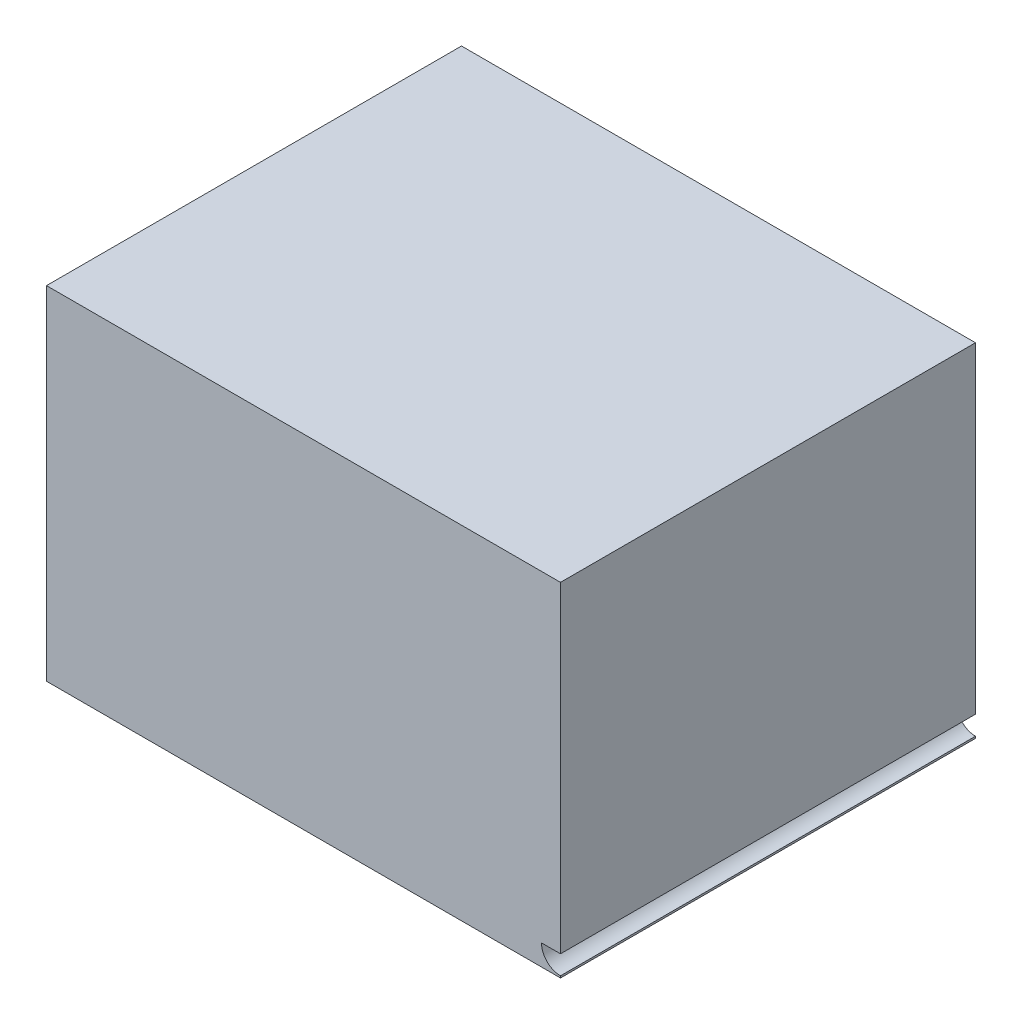
ISO-10303-21;
HEADER;
FILE_DESCRIPTION(('STEP AP214'),'2;1');
FILE_NAME('part.step','',(''),(''),'','','');
FILE_SCHEMA(('AUTOMOTIVE_DESIGN { 1 0 10303 214 1 1 1 1 }'));
ENDSEC;
DATA;
#1=APPLICATION_CONTEXT('core data for automotive mechanical design processes');
#2=APPLICATION_PROTOCOL_DEFINITION('international standard','automotive_design',2000,#1);
#3=PRODUCT_CONTEXT('',#1,'mechanical');
#4=PRODUCT('Part','Part','',(#3));
#5=PRODUCT_RELATED_PRODUCT_CATEGORY('part','',(#4));
#6=PRODUCT_DEFINITION_FORMATION('','',#4);
#7=PRODUCT_DEFINITION_CONTEXT('part definition',#1,'design');
#8=PRODUCT_DEFINITION('design','',#6,#7);
#9=PRODUCT_DEFINITION_SHAPE('','',#8);
#10=(LENGTH_UNIT() NAMED_UNIT(*) SI_UNIT(.MILLI.,.METRE.));
#11=(NAMED_UNIT(*) PLANE_ANGLE_UNIT() SI_UNIT($,.RADIAN.));
#12=(NAMED_UNIT(*) SI_UNIT($,.STERADIAN.) SOLID_ANGLE_UNIT());
#13=UNCERTAINTY_MEASURE_WITH_UNIT(LENGTH_MEASURE(1.E-05),#10,'distance_accuracy_value','');
#14=(GEOMETRIC_REPRESENTATION_CONTEXT(3) GLOBAL_UNCERTAINTY_ASSIGNED_CONTEXT((#13)) GLOBAL_UNIT_ASSIGNED_CONTEXT((#10,
#11,#12)) REPRESENTATION_CONTEXT('',''));
#15=CARTESIAN_POINT('',(0.,0.,0.));
#16=DIRECTION('',(0.,0.,1.));
#17=DIRECTION('',(1.,0.,0.));
#18=AXIS2_PLACEMENT_3D('',#15,#16,#17);
#19=CARTESIAN_POINT('',(-17.75,121.623637996561,-10.));
#20=DIRECTION('',(0.,0.,1.));
#21=DIRECTION('',(1.,0.,0.));
#22=AXIS2_PLACEMENT_3D('',#19,#20,#21);
#23=PLANE('',#22);
#24=DIRECTION('',(0.,-1.,0.));
#25=VECTOR('',#24,1.);
#26=CARTESIAN_POINT('',(-17.75,121.623637996561,-10.));
#27=LINE('',#26,#25);
#28=CARTESIAN_POINT('',(-17.75,70.,-10.));
#29=VERTEX_POINT('',#28);
#30=CARTESIAN_POINT('',(-17.75,53.1,-10.));
#31=VERTEX_POINT('',#30);
#32=EDGE_CURVE('E127',#29,#31,#27,.T.);
#33=ORIENTED_EDGE('',*,*,#32,.T.);
#34=DIRECTION('',(1.,0.,0.));
#35=VECTOR('',#34,1.);
#36=CARTESIAN_POINT('',(-18.75,53.1,-10.));
#37=LINE('',#36,#35);
#38=CARTESIAN_POINT('',(-18.75,53.1,-10.));
#39=VERTEX_POINT('',#38);
#40=EDGE_CURVE('E138',#39,#31,#37,.T.);
#41=ORIENTED_EDGE('',*,*,#40,.F.);
#42=CARTESIAN_POINT('',(-17.75,53.1,-10.));
#43=DIRECTION('',(0.,0.,-1.));
#44=DIRECTION('',(-1.,0.,0.));
#45=AXIS2_PLACEMENT_3D('',#42,#43,#44);
#46=CIRCLE('',#45,1.);
#47=CARTESIAN_POINT('',(-17.75,52.1,-10.));
#48=VERTEX_POINT('',#47);
#49=EDGE_CURVE('E144',#48,#39,#46,.T.);
#50=ORIENTED_EDGE('',*,*,#49,.F.);
#51=CARTESIAN_POINT('',(-17.75,52.,-10.));
#52=VERTEX_POINT('',#51);
#53=EDGE_CURVE('E130',#48,#52,#27,.T.);
#54=ORIENTED_EDGE('',*,*,#53,.T.);
#55=DIRECTION('',(-1.,0.,0.));
#56=VECTOR('',#55,1.);
#57=CARTESIAN_POINT('',(-17.75,52.,-10.));
#58=LINE('',#57,#56);
#59=CARTESIAN_POINT('',(-44.75,52.,-10.));
#60=VERTEX_POINT('',#59);
#61=EDGE_CURVE('E129',#52,#60,#58,.T.);
#62=ORIENTED_EDGE('',*,*,#61,.T.);
#63=DIRECTION('',(0.,-1.,0.));
#64=VECTOR('',#63,1.);
#65=CARTESIAN_POINT('',(-44.75,121.623637996561,-10.));
#66=LINE('',#65,#64);
#67=CARTESIAN_POINT('',(-44.75,70.,-10.));
#68=VERTEX_POINT('',#67);
#69=EDGE_CURVE('E61',#68,#60,#66,.T.);
#70=ORIENTED_EDGE('',*,*,#69,.F.);
#71=DIRECTION('',(-1.,0.,0.));
#72=VECTOR('',#71,1.);
#73=CARTESIAN_POINT('',(-17.75,70.,-10.));
#74=LINE('',#73,#72);
#75=EDGE_CURVE('E120',#29,#68,#74,.T.);
#76=ORIENTED_EDGE('',*,*,#75,.F.);
#77=EDGE_LOOP('',(#33,#41,#50,#54,#62,#70,#76));
#78=FACE_BOUND('',#77,.T.);
#79=ADVANCED_FACE('F38',(#78),#23,.F.);
#80=CARTESIAN_POINT('',(-17.75,53.1,35.4142135623731));
#81=DIRECTION('',(0.,0.,-1.));
#82=DIRECTION('',(-1.,0.,0.));
#83=AXIS2_PLACEMENT_3D('',#80,#81,#82);
#84=CYLINDRICAL_SURFACE('',#83,1.);
#85=CARTESIAN_POINT('',(-17.75,53.1,11.8));
#86=DIRECTION('',(0.,0.,1.));
#87=DIRECTION('',(0.,-1.,0.));
#88=AXIS2_PLACEMENT_3D('',#85,#86,#87);
#89=CIRCLE('',#88,1.);
#90=CARTESIAN_POINT('',(-17.75,52.1,11.8));
#91=VERTEX_POINT('',#90);
#92=CARTESIAN_POINT('',(-18.75,53.1,11.8));
#93=VERTEX_POINT('',#92);
#94=EDGE_CURVE('E11',#91,#93,#89,.F.);
#95=ORIENTED_EDGE('',*,*,#94,.F.);
#96=DIRECTION('',(0.,0.,-1.));
#97=VECTOR('',#96,1.);
#98=CARTESIAN_POINT('',(-17.75,52.1,35.4142135623731));
#99=LINE('',#98,#97);
#100=EDGE_CURVE('E135',#91,#48,#99,.T.);
#101=ORIENTED_EDGE('',*,*,#100,.T.);
#102=ORIENTED_EDGE('',*,*,#49,.T.);
#103=DIRECTION('',(0.,0.,-1.));
#104=VECTOR('',#103,1.);
#105=CARTESIAN_POINT('',(-18.75,53.1,35.4142135623731));
#106=LINE('',#105,#104);
#107=EDGE_CURVE('E137',#93,#39,#106,.T.);
#108=ORIENTED_EDGE('',*,*,#107,.F.);
#109=EDGE_LOOP('',(#95,#101,#102,#108));
#110=FACE_BOUND('',#109,.T.);
#111=ADVANCED_FACE('F159',(#110),#84,.F.);
#112=CARTESIAN_POINT('',(-18.75,53.1,35.4142135623731));
#113=DIRECTION('',(0.,1.,0.));
#114=DIRECTION('',(0.,0.,1.));
#115=AXIS2_PLACEMENT_3D('',#112,#113,#114);
#116=PLANE('',#115);
#117=DIRECTION('',(1.,0.,0.));
#118=VECTOR('',#117,1.);
#119=CARTESIAN_POINT('',(-18.75,53.1,11.8));
#120=LINE('',#119,#118);
#121=CARTESIAN_POINT('',(-17.75,53.1,11.8));
#122=VERTEX_POINT('',#121);
#123=EDGE_CURVE('E118',#93,#122,#120,.T.);
#124=ORIENTED_EDGE('',*,*,#123,.F.);
#125=ORIENTED_EDGE('',*,*,#107,.T.);
#126=ORIENTED_EDGE('',*,*,#40,.T.);
#127=DIRECTION('',(0.,0.,-1.));
#128=VECTOR('',#127,1.);
#129=CARTESIAN_POINT('',(-17.75,53.1,35.4142135623731));
#130=LINE('',#129,#128);
#131=EDGE_CURVE('E140',#122,#31,#130,.T.);
#132=ORIENTED_EDGE('',*,*,#131,.F.);
#133=EDGE_LOOP('',(#124,#125,#126,#132));
#134=FACE_BOUND('',#133,.T.);
#135=ADVANCED_FACE('F162',(#134),#116,.F.);
#136=CARTESIAN_POINT('',(0.,52.,0.));
#137=DIRECTION('',(0.,-1.,0.));
#138=DIRECTION('',(0.,0.,-1.));
#139=AXIS2_PLACEMENT_3D('',#136,#137,#138);
#140=PLANE('',#139);
#141=DIRECTION('',(0.,0.,-1.));
#142=VECTOR('',#141,1.);
#143=CARTESIAN_POINT('',(-17.75,52.,-10.));
#144=LINE('',#143,#142);
#145=CARTESIAN_POINT('',(-17.75,52.,11.8));
#146=VERTEX_POINT('',#145);
#147=EDGE_CURVE('E71',#146,#52,#144,.T.);
#148=ORIENTED_EDGE('',*,*,#147,.F.);
#149=DIRECTION('',(1.,0.,0.));
#150=VECTOR('',#149,1.);
#151=CARTESIAN_POINT('',(-62.7544438958831,52.,11.8));
#152=LINE('',#151,#150);
#153=CARTESIAN_POINT('',(-44.75,52.,11.8));
#154=VERTEX_POINT('',#153);
#155=EDGE_CURVE('E113',#154,#146,#152,.T.);
#156=ORIENTED_EDGE('',*,*,#155,.F.);
#157=DIRECTION('',(0.,0.,1.));
#158=VECTOR('',#157,1.);
#159=CARTESIAN_POINT('',(-44.75,52.,-10.));
#160=LINE('',#159,#158);
#161=EDGE_CURVE('E117',#60,#154,#160,.T.);
#162=ORIENTED_EDGE('',*,*,#161,.F.);
#163=ORIENTED_EDGE('',*,*,#61,.F.);
#164=EDGE_LOOP('',(#148,#156,#162,#163));
#165=FACE_BOUND('',#164,.T.);
#166=ADVANCED_FACE('F154',(#165),#140,.T.);
#167=CARTESIAN_POINT('',(0.,70.,0.));
#168=DIRECTION('',(0.,1.,0.));
#169=DIRECTION('',(0.,0.,1.));
#170=AXIS2_PLACEMENT_3D('',#167,#168,#169);
#171=PLANE('',#170);
#172=DIRECTION('',(0.,0.,1.));
#173=VECTOR('',#172,1.);
#174=CARTESIAN_POINT('',(-44.75,70.,-10.));
#175=LINE('',#174,#173);
#176=CARTESIAN_POINT('',(-44.75,70.,11.8));
#177=VERTEX_POINT('',#176);
#178=EDGE_CURVE('E46',#68,#177,#175,.T.);
#179=ORIENTED_EDGE('',*,*,#178,.T.);
#180=DIRECTION('',(1.,0.,0.));
#181=VECTOR('',#180,1.);
#182=CARTESIAN_POINT('',(-62.7544438958831,70.,11.8));
#183=LINE('',#182,#181);
#184=CARTESIAN_POINT('',(-17.75,70.,11.8));
#185=VERTEX_POINT('',#184);
#186=EDGE_CURVE('E105',#177,#185,#183,.T.);
#187=ORIENTED_EDGE('',*,*,#186,.T.);
#188=DIRECTION('',(0.,0.,-1.));
#189=VECTOR('',#188,1.);
#190=CARTESIAN_POINT('',(-17.75,70.,-10.));
#191=LINE('',#190,#189);
#192=EDGE_CURVE('E79',#185,#29,#191,.T.);
#193=ORIENTED_EDGE('',*,*,#192,.T.);
#194=ORIENTED_EDGE('',*,*,#75,.T.);
#195=EDGE_LOOP('',(#179,#187,#193,#194));
#196=FACE_BOUND('',#195,.T.);
#197=ADVANCED_FACE('F40',(#196),#171,.T.);
#198=CARTESIAN_POINT('',(-44.75,121.623637996561,-10.));
#199=DIRECTION('',(1.,0.,0.));
#200=DIRECTION('',(0.,0.,-1.));
#201=AXIS2_PLACEMENT_3D('',#198,#199,#200);
#202=PLANE('',#201);
#203=DIRECTION('',(0.,-1.,0.));
#204=VECTOR('',#203,1.);
#205=CARTESIAN_POINT('',(-44.75,0.,11.8));
#206=LINE('',#205,#204);
#207=EDGE_CURVE('E108',#177,#154,#206,.T.);
#208=ORIENTED_EDGE('',*,*,#207,.F.);
#209=ORIENTED_EDGE('',*,*,#178,.F.);
#210=ORIENTED_EDGE('',*,*,#69,.T.);
#211=ORIENTED_EDGE('',*,*,#161,.T.);
#212=EDGE_LOOP('',(#208,#209,#210,#211));
#213=FACE_BOUND('',#212,.T.);
#214=ADVANCED_FACE('F115',(#213),#202,.F.);
#215=CARTESIAN_POINT('',(-17.75,121.623637996561,-10.));
#216=DIRECTION('',(-1.,0.,0.));
#217=DIRECTION('',(0.,0.,1.));
#218=AXIS2_PLACEMENT_3D('',#215,#216,#217);
#219=PLANE('',#218);
#220=DIRECTION('',(0.,-1.,0.));
#221=VECTOR('',#220,1.);
#222=CARTESIAN_POINT('',(-17.75,0.,11.8));
#223=LINE('',#222,#221);
#224=EDGE_CURVE('E52',#91,#146,#223,.T.);
#225=ORIENTED_EDGE('',*,*,#224,.T.);
#226=ORIENTED_EDGE('',*,*,#147,.T.);
#227=ORIENTED_EDGE('',*,*,#53,.F.);
#228=ORIENTED_EDGE('',*,*,#100,.F.);
#229=EDGE_LOOP('',(#225,#226,#227,#228));
#230=FACE_BOUND('',#229,.T.);
#231=ADVANCED_FACE('F152',(#230),#219,.F.);
#232=EDGE_CURVE('E111',#185,#122,#223,.T.);
#233=ORIENTED_EDGE('',*,*,#232,.T.);
#234=ORIENTED_EDGE('',*,*,#131,.T.);
#235=ORIENTED_EDGE('',*,*,#32,.F.);
#236=ORIENTED_EDGE('',*,*,#192,.F.);
#237=EDGE_LOOP('',(#233,#234,#235,#236));
#238=FACE_BOUND('',#237,.T.);
#239=ADVANCED_FACE('F164',(#238),#219,.F.);
#240=CARTESIAN_POINT('',(-62.7544438958831,0.,11.8));
#241=DIRECTION('',(0.,0.,1.));
#242=DIRECTION('',(0.,-1.,0.));
#243=AXIS2_PLACEMENT_3D('',#240,#241,#242);
#244=PLANE('',#243);
#245=ORIENTED_EDGE('',*,*,#123,.T.);
#246=ORIENTED_EDGE('',*,*,#232,.F.);
#247=ORIENTED_EDGE('',*,*,#186,.F.);
#248=ORIENTED_EDGE('',*,*,#207,.T.);
#249=ORIENTED_EDGE('',*,*,#155,.T.);
#250=ORIENTED_EDGE('',*,*,#224,.F.);
#251=ORIENTED_EDGE('',*,*,#94,.T.);
#252=EDGE_LOOP('',(#245,#246,#247,#248,#249,#250,#251));
#253=FACE_BOUND('',#252,.T.);
#254=ADVANCED_FACE('F107',(#253),#244,.T.);
#255=CLOSED_SHELL('',(#79,#111,#135,#166,#197,#214,#231,#239,#254));
#256=MANIFOLD_SOLID_BREP('B2',#255);
#257=ADVANCED_BREP_SHAPE_REPRESENTATION('',(#18,#256),#14);
#258=SHAPE_DEFINITION_REPRESENTATION(#9,#257);
ENDSEC;
END-ISO-10303-21;
